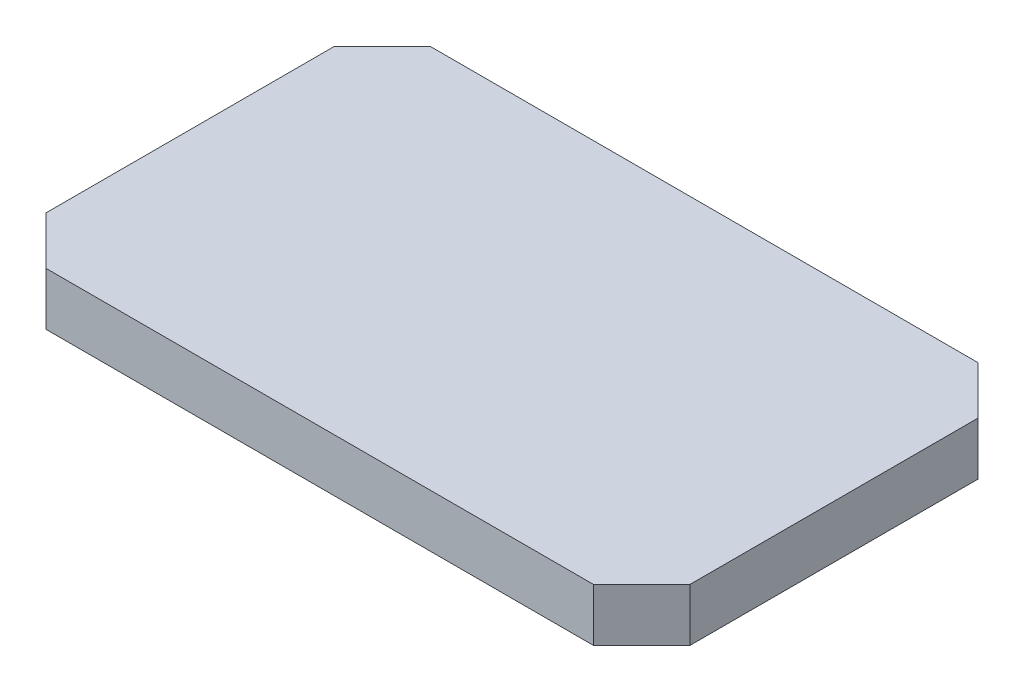
ISO-10303-21;
HEADER;
FILE_DESCRIPTION(('STEP AP214'),'2;1');
FILE_NAME('part.step','',(''),(''),'','','');
FILE_SCHEMA(('AUTOMOTIVE_DESIGN { 1 0 10303 214 1 1 1 1 }'));
ENDSEC;
DATA;
#1=APPLICATION_CONTEXT('core data for automotive mechanical design processes');
#2=APPLICATION_PROTOCOL_DEFINITION('international standard','automotive_design',2000,#1);
#3=PRODUCT_CONTEXT('',#1,'mechanical');
#4=PRODUCT('Part','Part','',(#3));
#5=PRODUCT_RELATED_PRODUCT_CATEGORY('part','',(#4));
#6=PRODUCT_DEFINITION_FORMATION('','',#4);
#7=PRODUCT_DEFINITION_CONTEXT('part definition',#1,'design');
#8=PRODUCT_DEFINITION('design','',#6,#7);
#9=PRODUCT_DEFINITION_SHAPE('','',#8);
#10=(LENGTH_UNIT() NAMED_UNIT(*) SI_UNIT(.MILLI.,.METRE.));
#11=(NAMED_UNIT(*) PLANE_ANGLE_UNIT() SI_UNIT($,.RADIAN.));
#12=(NAMED_UNIT(*) SI_UNIT($,.STERADIAN.) SOLID_ANGLE_UNIT());
#13=UNCERTAINTY_MEASURE_WITH_UNIT(LENGTH_MEASURE(1.E-05),#10,'distance_accuracy_value','');
#14=(GEOMETRIC_REPRESENTATION_CONTEXT(3) GLOBAL_UNCERTAINTY_ASSIGNED_CONTEXT((#13)) GLOBAL_UNIT_ASSIGNED_CONTEXT((#10,
#11,#12)) REPRESENTATION_CONTEXT('',''));
#15=CARTESIAN_POINT('',(0.,0.,0.));
#16=DIRECTION('',(0.,0.,1.));
#17=DIRECTION('',(1.,0.,0.));
#18=AXIS2_PLACEMENT_3D('',#15,#16,#17);
#19=CARTESIAN_POINT('',(33.5,5.5,-20.));
#20=DIRECTION('',(-1.,0.,0.));
#21=DIRECTION('',(0.,0.,1.));
#22=AXIS2_PLACEMENT_3D('',#19,#20,#21);
#23=PLANE('',#22);
#24=DIRECTION('',(0.,0.,-1.));
#25=VECTOR('',#24,1.);
#26=CARTESIAN_POINT('',(33.5,0.,-20.));
#27=LINE('',#26,#25);
#28=CARTESIAN_POINT('',(33.5,0.,15.));
#29=VERTEX_POINT('',#28);
#30=CARTESIAN_POINT('',(33.5,0.,-15.));
#31=VERTEX_POINT('',#30);
#32=EDGE_CURVE('E126',#29,#31,#27,.T.);
#33=ORIENTED_EDGE('',*,*,#32,.T.);
#34=DIRECTION('',(0.,1.,0.));
#35=VECTOR('',#34,1.);
#36=CARTESIAN_POINT('',(33.5,5.5,-15.));
#37=LINE('',#36,#35);
#38=CARTESIAN_POINT('',(33.5,5.5,-15.));
#39=VERTEX_POINT('',#38);
#40=EDGE_CURVE('E103',#31,#39,#37,.T.);
#41=ORIENTED_EDGE('',*,*,#40,.T.);
#42=DIRECTION('',(0.,0.,-1.));
#43=VECTOR('',#42,1.);
#44=CARTESIAN_POINT('',(33.5,5.5,-20.));
#45=LINE('',#44,#43);
#46=CARTESIAN_POINT('',(33.5,5.5,15.));
#47=VERTEX_POINT('',#46);
#48=EDGE_CURVE('E135',#47,#39,#45,.T.);
#49=ORIENTED_EDGE('',*,*,#48,.F.);
#50=DIRECTION('',(0.,-1.,0.));
#51=VECTOR('',#50,1.);
#52=CARTESIAN_POINT('',(33.5,5.5,15.));
#53=LINE('',#52,#51);
#54=EDGE_CURVE('E108',#47,#29,#53,.T.);
#55=ORIENTED_EDGE('',*,*,#54,.T.);
#56=EDGE_LOOP('',(#33,#41,#49,#55));
#57=FACE_BOUND('',#56,.T.);
#58=ADVANCED_FACE('F31',(#57),#23,.F.);
#59=CARTESIAN_POINT('',(-33.5,5.5,-20.));
#60=DIRECTION('',(0.,0.,1.));
#61=DIRECTION('',(1.,0.,0.));
#62=AXIS2_PLACEMENT_3D('',#59,#60,#61);
#63=PLANE('',#62);
#64=DIRECTION('',(-1.,0.,0.));
#65=VECTOR('',#64,1.);
#66=CARTESIAN_POINT('',(-33.5,5.5,-20.));
#67=LINE('',#66,#65);
#68=CARTESIAN_POINT('',(28.5,5.5,-20.));
#69=VERTEX_POINT('',#68);
#70=CARTESIAN_POINT('',(-28.5,5.5,-20.));
#71=VERTEX_POINT('',#70);
#72=EDGE_CURVE('E118',#69,#71,#67,.T.);
#73=ORIENTED_EDGE('',*,*,#72,.F.);
#74=DIRECTION('',(0.,-1.,0.));
#75=VECTOR('',#74,1.);
#76=CARTESIAN_POINT('',(28.5,5.5,-20.));
#77=LINE('',#76,#75);
#78=CARTESIAN_POINT('',(28.5,0.,-20.));
#79=VERTEX_POINT('',#78);
#80=EDGE_CURVE('E102',#69,#79,#77,.T.);
#81=ORIENTED_EDGE('',*,*,#80,.T.);
#82=DIRECTION('',(-1.,0.,0.));
#83=VECTOR('',#82,1.);
#84=CARTESIAN_POINT('',(-33.5,0.,-20.));
#85=LINE('',#84,#83);
#86=CARTESIAN_POINT('',(-28.5,0.,-20.));
#87=VERTEX_POINT('',#86);
#88=EDGE_CURVE('E115',#79,#87,#85,.T.);
#89=ORIENTED_EDGE('',*,*,#88,.T.);
#90=DIRECTION('',(0.,1.,0.));
#91=VECTOR('',#90,1.);
#92=CARTESIAN_POINT('',(-28.5,5.5,-20.));
#93=LINE('',#92,#91);
#94=EDGE_CURVE('E120',#87,#71,#93,.T.);
#95=ORIENTED_EDGE('',*,*,#94,.T.);
#96=EDGE_LOOP('',(#73,#81,#89,#95));
#97=FACE_BOUND('',#96,.T.);
#98=ADVANCED_FACE('F114',(#97),#63,.F.);
#99=CARTESIAN_POINT('',(-33.5,5.5,-20.));
#100=DIRECTION('',(1.,0.,0.));
#101=DIRECTION('',(0.,0.,-1.));
#102=AXIS2_PLACEMENT_3D('',#99,#100,#101);
#103=PLANE('',#102);
#104=DIRECTION('',(0.,0.,1.));
#105=VECTOR('',#104,1.);
#106=CARTESIAN_POINT('',(-33.5,5.5,-20.));
#107=LINE('',#106,#105);
#108=CARTESIAN_POINT('',(-33.5,5.5,-15.));
#109=VERTEX_POINT('',#108);
#110=CARTESIAN_POINT('',(-33.5,5.5,15.));
#111=VERTEX_POINT('',#110);
#112=EDGE_CURVE('E158',#109,#111,#107,.T.);
#113=ORIENTED_EDGE('',*,*,#112,.F.);
#114=DIRECTION('',(0.,-1.,0.));
#115=VECTOR('',#114,1.);
#116=CARTESIAN_POINT('',(-33.5,5.5,-15.));
#117=LINE('',#116,#115);
#118=CARTESIAN_POINT('',(-33.5,0.,-15.));
#119=VERTEX_POINT('',#118);
#120=EDGE_CURVE('E11',#109,#119,#117,.T.);
#121=ORIENTED_EDGE('',*,*,#120,.T.);
#122=DIRECTION('',(0.,0.,1.));
#123=VECTOR('',#122,1.);
#124=CARTESIAN_POINT('',(-33.5,0.,-20.));
#125=LINE('',#124,#123);
#126=CARTESIAN_POINT('',(-33.5,0.,15.));
#127=VERTEX_POINT('',#126);
#128=EDGE_CURVE('E125',#119,#127,#125,.T.);
#129=ORIENTED_EDGE('',*,*,#128,.T.);
#130=DIRECTION('',(0.,1.,0.));
#131=VECTOR('',#130,1.);
#132=CARTESIAN_POINT('',(-33.5,5.5,15.));
#133=LINE('',#132,#131);
#134=EDGE_CURVE('E39',#127,#111,#133,.T.);
#135=ORIENTED_EDGE('',*,*,#134,.T.);
#136=EDGE_LOOP('',(#113,#121,#129,#135));
#137=FACE_BOUND('',#136,.T.);
#138=ADVANCED_FACE('F157',(#137),#103,.F.);
#139=CARTESIAN_POINT('',(-33.5,5.5,20.));
#140=DIRECTION('',(0.,0.,-1.));
#141=DIRECTION('',(-1.,0.,0.));
#142=AXIS2_PLACEMENT_3D('',#139,#140,#141);
#143=PLANE('',#142);
#144=DIRECTION('',(1.,0.,0.));
#145=VECTOR('',#144,1.);
#146=CARTESIAN_POINT('',(-33.5,0.,20.));
#147=LINE('',#146,#145);
#148=CARTESIAN_POINT('',(-28.5,0.,20.));
#149=VERTEX_POINT('',#148);
#150=CARTESIAN_POINT('',(28.5,0.,20.));
#151=VERTEX_POINT('',#150);
#152=EDGE_CURVE('E129',#149,#151,#147,.T.);
#153=ORIENTED_EDGE('',*,*,#152,.T.);
#154=DIRECTION('',(0.,1.,0.));
#155=VECTOR('',#154,1.);
#156=CARTESIAN_POINT('',(28.5,5.5,20.));
#157=LINE('',#156,#155);
#158=CARTESIAN_POINT('',(28.5,5.5,20.));
#159=VERTEX_POINT('',#158);
#160=EDGE_CURVE('E46',#151,#159,#157,.T.);
#161=ORIENTED_EDGE('',*,*,#160,.T.);
#162=DIRECTION('',(1.,0.,0.));
#163=VECTOR('',#162,1.);
#164=CARTESIAN_POINT('',(-33.5,5.5,20.));
#165=LINE('',#164,#163);
#166=CARTESIAN_POINT('',(-28.5,5.5,20.));
#167=VERTEX_POINT('',#166);
#168=EDGE_CURVE('E136',#167,#159,#165,.T.);
#169=ORIENTED_EDGE('',*,*,#168,.F.);
#170=DIRECTION('',(0.,-1.,0.));
#171=VECTOR('',#170,1.);
#172=CARTESIAN_POINT('',(-28.5,5.5,20.));
#173=LINE('',#172,#171);
#174=EDGE_CURVE('E151',#167,#149,#173,.T.);
#175=ORIENTED_EDGE('',*,*,#174,.T.);
#176=EDGE_LOOP('',(#153,#161,#169,#175));
#177=FACE_BOUND('',#176,.T.);
#178=ADVANCED_FACE('F167',(#177),#143,.F.);
#179=CARTESIAN_POINT('',(33.5,5.5,20.));
#180=DIRECTION('',(0.,1.,0.));
#181=DIRECTION('',(0.,0.,1.));
#182=AXIS2_PLACEMENT_3D('',#179,#180,#181);
#183=PLANE('',#182);
#184=ORIENTED_EDGE('',*,*,#48,.T.);
#185=DIRECTION('',(0.707106781186547,0.,0.707106781186549));
#186=VECTOR('',#185,1.);
#187=CARTESIAN_POINT('',(51.,5.5,2.50000000000007));
#188=LINE('',#187,#186);
#189=EDGE_CURVE('E149',#39,#69,#188,.F.);
#190=ORIENTED_EDGE('',*,*,#189,.T.);
#191=ORIENTED_EDGE('',*,*,#72,.T.);
#192=DIRECTION('',(0.707106781186549,0.,-0.707106781186546));
#193=VECTOR('',#192,1.);
#194=CARTESIAN_POINT('',(-17.4999999999999,5.5,-31.0000000000001));
#195=LINE('',#194,#193);
#196=EDGE_CURVE('E145',#71,#109,#195,.F.);
#197=ORIENTED_EDGE('',*,*,#196,.T.);
#198=ORIENTED_EDGE('',*,*,#112,.T.);
#199=DIRECTION('',(-0.707106781186547,0.,-0.707106781186549));
#200=VECTOR('',#199,1.);
#201=CARTESIAN_POINT('',(2.49999999999992,5.5,51.));
#202=LINE('',#201,#200);
#203=EDGE_CURVE('E53',#111,#167,#202,.F.);
#204=ORIENTED_EDGE('',*,*,#203,.T.);
#205=ORIENTED_EDGE('',*,*,#168,.T.);
#206=DIRECTION('',(-0.707106781186549,0.,0.707106781186547));
#207=VECTOR('',#206,1.);
#208=CARTESIAN_POINT('',(31.,5.5,17.5));
#209=LINE('',#208,#207);
#210=EDGE_CURVE('E147',#159,#47,#209,.F.);
#211=ORIENTED_EDGE('',*,*,#210,.T.);
#212=EDGE_LOOP('',(#184,#190,#191,#197,#198,#204,#205,#211));
#213=FACE_BOUND('',#212,.T.);
#214=ADVANCED_FACE('F162',(#213),#183,.T.);
#215=CARTESIAN_POINT('',(33.5,0.,20.));
#216=DIRECTION('',(0.,1.,0.));
#217=DIRECTION('',(0.,0.,1.));
#218=AXIS2_PLACEMENT_3D('',#215,#216,#217);
#219=PLANE('',#218);
#220=ORIENTED_EDGE('',*,*,#88,.F.);
#221=DIRECTION('',(-0.707106781186547,0.,-0.707106781186549));
#222=VECTOR('',#221,1.);
#223=CARTESIAN_POINT('',(28.5,0.,-20.));
#224=LINE('',#223,#222);
#225=EDGE_CURVE('E98',#79,#31,#224,.F.);
#226=ORIENTED_EDGE('',*,*,#225,.T.);
#227=ORIENTED_EDGE('',*,*,#32,.F.);
#228=DIRECTION('',(0.707106781186549,0.,-0.707106781186547));
#229=VECTOR('',#228,1.);
#230=CARTESIAN_POINT('',(33.5,0.,15.));
#231=LINE('',#230,#229);
#232=EDGE_CURVE('E109',#29,#151,#231,.F.);
#233=ORIENTED_EDGE('',*,*,#232,.T.);
#234=ORIENTED_EDGE('',*,*,#152,.F.);
#235=DIRECTION('',(0.707106781186547,0.,0.707106781186549));
#236=VECTOR('',#235,1.);
#237=CARTESIAN_POINT('',(-28.5,0.,20.));
#238=LINE('',#237,#236);
#239=EDGE_CURVE('E119',#149,#127,#238,.F.);
#240=ORIENTED_EDGE('',*,*,#239,.T.);
#241=ORIENTED_EDGE('',*,*,#128,.F.);
#242=DIRECTION('',(-0.707106781186549,0.,0.707106781186546));
#243=VECTOR('',#242,1.);
#244=CARTESIAN_POINT('',(-33.5,0.,-15.));
#245=LINE('',#244,#243);
#246=EDGE_CURVE('E124',#119,#87,#245,.F.);
#247=ORIENTED_EDGE('',*,*,#246,.T.);
#248=EDGE_LOOP('',(#220,#226,#227,#233,#234,#240,#241,#247));
#249=FACE_BOUND('',#248,.T.);
#250=ADVANCED_FACE('F122',(#249),#219,.F.);
#251=CARTESIAN_POINT('',(28.5,5.5,-20.));
#252=DIRECTION('',(-0.707106781186548,0.,0.707106781186546));
#253=DIRECTION('',(0.707106781186547,0.,0.707106781186549));
#254=AXIS2_PLACEMENT_3D('',#251,#252,#253);
#255=PLANE('',#254);
#256=ORIENTED_EDGE('',*,*,#189,.F.);
#257=ORIENTED_EDGE('',*,*,#40,.F.);
#258=ORIENTED_EDGE('',*,*,#225,.F.);
#259=ORIENTED_EDGE('',*,*,#80,.F.);
#260=EDGE_LOOP('',(#256,#257,#258,#259));
#261=FACE_BOUND('',#260,.T.);
#262=ADVANCED_FACE('F101',(#261),#255,.F.);
#263=CARTESIAN_POINT('',(33.5,5.5,15.));
#264=DIRECTION('',(-0.707106781186547,0.,-0.707106781186549));
#265=DIRECTION('',(-0.707106781186549,0.,0.707106781186547));
#266=AXIS2_PLACEMENT_3D('',#263,#264,#265);
#267=PLANE('',#266);
#268=ORIENTED_EDGE('',*,*,#210,.F.);
#269=ORIENTED_EDGE('',*,*,#160,.F.);
#270=ORIENTED_EDGE('',*,*,#232,.F.);
#271=ORIENTED_EDGE('',*,*,#54,.F.);
#272=EDGE_LOOP('',(#268,#269,#270,#271));
#273=FACE_BOUND('',#272,.T.);
#274=ADVANCED_FACE('F171',(#273),#267,.F.);
#275=CARTESIAN_POINT('',(-33.5,5.5,-15.));
#276=DIRECTION('',(0.707106781186546,0.,0.707106781186549));
#277=DIRECTION('',(0.707106781186549,0.,-0.707106781186546));
#278=AXIS2_PLACEMENT_3D('',#275,#276,#277);
#279=PLANE('',#278);
#280=ORIENTED_EDGE('',*,*,#196,.F.);
#281=ORIENTED_EDGE('',*,*,#94,.F.);
#282=ORIENTED_EDGE('',*,*,#246,.F.);
#283=ORIENTED_EDGE('',*,*,#120,.F.);
#284=EDGE_LOOP('',(#280,#281,#282,#283));
#285=FACE_BOUND('',#284,.T.);
#286=ADVANCED_FACE('F177',(#285),#279,.F.);
#287=CARTESIAN_POINT('',(-28.5,5.5,20.));
#288=DIRECTION('',(0.707106781186549,0.,-0.707106781186547));
#289=DIRECTION('',(-0.707106781186547,0.,-0.707106781186549));
#290=AXIS2_PLACEMENT_3D('',#287,#288,#289);
#291=PLANE('',#290);
#292=ORIENTED_EDGE('',*,*,#203,.F.);
#293=ORIENTED_EDGE('',*,*,#134,.F.);
#294=ORIENTED_EDGE('',*,*,#239,.F.);
#295=ORIENTED_EDGE('',*,*,#174,.F.);
#296=EDGE_LOOP('',(#292,#293,#294,#295));
#297=FACE_BOUND('',#296,.T.);
#298=ADVANCED_FACE('F33',(#297),#291,.F.);
#299=CLOSED_SHELL('',(#58,#98,#138,#178,#214,#250,#262,#274,#286,#298));
#300=MANIFOLD_SOLID_BREP('B2',#299);
#301=ADVANCED_BREP_SHAPE_REPRESENTATION('',(#18,#300),#14);
#302=SHAPE_DEFINITION_REPRESENTATION(#9,#301);
ENDSEC;
END-ISO-10303-21;
